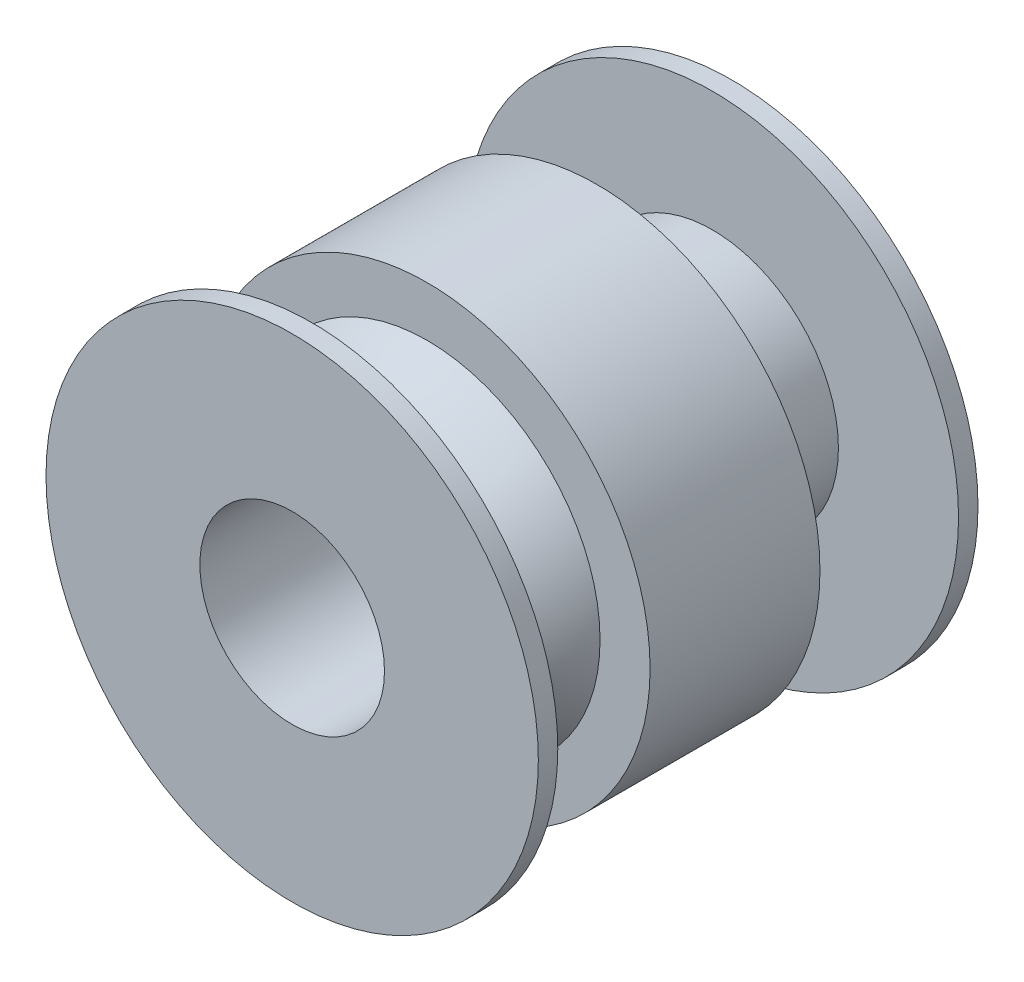
ISO-10303-21;
HEADER;
FILE_DESCRIPTION(('STEP AP214'),'2;1');
FILE_NAME('part.step','',(''),(''),'','','');
FILE_SCHEMA(('AUTOMOTIVE_DESIGN { 1 0 10303 214 1 1 1 1 }'));
ENDSEC;
DATA;
#1=APPLICATION_CONTEXT('core data for automotive mechanical design processes');
#2=APPLICATION_PROTOCOL_DEFINITION('international standard','automotive_design',2000,#1);
#3=PRODUCT_CONTEXT('',#1,'mechanical');
#4=PRODUCT('Part','Part','',(#3));
#5=PRODUCT_RELATED_PRODUCT_CATEGORY('part','',(#4));
#6=PRODUCT_DEFINITION_FORMATION('','',#4);
#7=PRODUCT_DEFINITION_CONTEXT('part definition',#1,'design');
#8=PRODUCT_DEFINITION('design','',#6,#7);
#9=PRODUCT_DEFINITION_SHAPE('','',#8);
#10=(LENGTH_UNIT() NAMED_UNIT(*) SI_UNIT(.MILLI.,.METRE.));
#11=(NAMED_UNIT(*) PLANE_ANGLE_UNIT() SI_UNIT($,.RADIAN.));
#12=(NAMED_UNIT(*) SI_UNIT($,.STERADIAN.) SOLID_ANGLE_UNIT());
#13=UNCERTAINTY_MEASURE_WITH_UNIT(LENGTH_MEASURE(1.E-05),#10,'distance_accuracy_value','');
#14=(GEOMETRIC_REPRESENTATION_CONTEXT(3) GLOBAL_UNCERTAINTY_ASSIGNED_CONTEXT((#13)) GLOBAL_UNIT_ASSIGNED_CONTEXT((#10,
#11,#12)) REPRESENTATION_CONTEXT('',''));
#15=CARTESIAN_POINT('',(0.,0.,0.));
#16=DIRECTION('',(0.,0.,1.));
#17=DIRECTION('',(1.,0.,0.));
#18=AXIS2_PLACEMENT_3D('',#15,#16,#17);
#19=CARTESIAN_POINT('',(0.,-34.749232,-82.4611));
#20=DIRECTION('',(0.,0.,-1.));
#21=DIRECTION('',(-1.,0.,0.));
#22=AXIS2_PLACEMENT_3D('',#19,#20,#21);
#23=PLANE('',#22);
#24=CARTESIAN_POINT('',(0.,-22.049232,-82.4611));
#25=DIRECTION('',(0.,0.,1.));
#26=DIRECTION('',(1.,0.,0.));
#27=AXIS2_PLACEMENT_3D('',#24,#25,#26);
#28=CIRCLE('',#27,4.7625);
#29=CARTESIAN_POINT('',(4.7625,-22.049232,-82.4611));
#30=VERTEX_POINT('',#29);
#31=EDGE_CURVE('E10',#30,#30,#28,.T.);
#32=ORIENTED_EDGE('',*,*,#31,.T.);
#33=EDGE_LOOP('',(#32));
#34=FACE_BOUND('',#33,.T.);
#35=CARTESIAN_POINT('',(0.,-22.049232,-82.4611));
#36=DIRECTION('',(0.,0.,1.));
#37=DIRECTION('',(1.,0.,0.));
#38=AXIS2_PLACEMENT_3D('',#35,#36,#37);
#39=CIRCLE('',#38,12.7);
#40=CARTESIAN_POINT('',(12.7,-22.049232,-82.4611));
#41=VERTEX_POINT('',#40);
#42=EDGE_CURVE('E98',#41,#41,#39,.T.);
#43=ORIENTED_EDGE('',*,*,#42,.F.);
#44=EDGE_LOOP('',(#43));
#45=FACE_BOUND('',#44,.T.);
#46=ADVANCED_FACE('F39',(#34,#45),#23,.T.);
#47=CARTESIAN_POINT('',(0.,-22.049232,-82.1361730867633));
#48=DIRECTION('',(0.,0.,1.));
#49=DIRECTION('',(1.,0.,0.));
#50=AXIS2_PLACEMENT_3D('',#47,#48,#49);
#51=CYLINDRICAL_SURFACE('',#50,4.7625);
#52=CARTESIAN_POINT('',(0.,-22.049232,-59.7789));
#53=DIRECTION('',(0.,0.,1.));
#54=DIRECTION('',(1.,0.,0.));
#55=AXIS2_PLACEMENT_3D('',#52,#53,#54);
#56=CIRCLE('',#55,4.7625);
#57=CARTESIAN_POINT('',(4.7625,-22.049232,-59.7789));
#58=VERTEX_POINT('',#57);
#59=EDGE_CURVE('E46',#58,#58,#56,.T.);
#60=ORIENTED_EDGE('',*,*,#59,.T.);
#61=EDGE_LOOP('',(#60));
#62=FACE_BOUND('',#61,.T.);
#63=ORIENTED_EDGE('',*,*,#31,.F.);
#64=EDGE_LOOP('',(#63));
#65=FACE_BOUND('',#64,.T.);
#66=ADVANCED_FACE('F107',(#62,#65),#51,.F.);
#67=CARTESIAN_POINT('',(0.,-34.749232,-59.7789));
#68=DIRECTION('',(0.,0.,1.));
#69=DIRECTION('',(1.,0.,0.));
#70=AXIS2_PLACEMENT_3D('',#67,#68,#69);
#71=PLANE('',#70);
#72=CARTESIAN_POINT('',(0.,-22.049232,-59.7789));
#73=DIRECTION('',(0.,0.,1.));
#74=DIRECTION('',(1.,0.,0.));
#75=AXIS2_PLACEMENT_3D('',#72,#73,#74);
#76=CIRCLE('',#75,12.7);
#77=CARTESIAN_POINT('',(12.7,-22.049232,-59.7789));
#78=VERTEX_POINT('',#77);
#79=EDGE_CURVE('E51',#78,#78,#76,.T.);
#80=ORIENTED_EDGE('',*,*,#79,.T.);
#81=EDGE_LOOP('',(#80));
#82=FACE_BOUND('',#81,.T.);
#83=ORIENTED_EDGE('',*,*,#59,.F.);
#84=EDGE_LOOP('',(#83));
#85=FACE_BOUND('',#84,.T.);
#86=ADVANCED_FACE('F111',(#82,#85),#71,.T.);
#87=CARTESIAN_POINT('',(0.,-22.049232,-82.1361730867633));
#88=DIRECTION('',(0.,0.,1.));
#89=DIRECTION('',(1.,0.,0.));
#90=AXIS2_PLACEMENT_3D('',#87,#88,#89);
#91=CYLINDRICAL_SURFACE('',#90,12.7);
#92=CARTESIAN_POINT('',(0.,-22.049232,-60.7822));
#93=DIRECTION('',(0.,0.,1.));
#94=DIRECTION('',(1.,0.,0.));
#95=AXIS2_PLACEMENT_3D('',#92,#93,#94);
#96=CIRCLE('',#95,12.7);
#97=CARTESIAN_POINT('',(12.7,-22.049232,-60.7822));
#98=VERTEX_POINT('',#97);
#99=EDGE_CURVE('E56',#98,#98,#96,.T.);
#100=ORIENTED_EDGE('',*,*,#99,.T.);
#101=EDGE_LOOP('',(#100));
#102=FACE_BOUND('',#101,.T.);
#103=ORIENTED_EDGE('',*,*,#79,.F.);
#104=EDGE_LOOP('',(#103));
#105=FACE_BOUND('',#104,.T.);
#106=ADVANCED_FACE('F115',(#102,#105),#91,.T.);
#107=CARTESIAN_POINT('',(0.,-28.551632,-60.7822));
#108=DIRECTION('',(0.,0.,-1.));
#109=DIRECTION('',(-1.,0.,0.));
#110=AXIS2_PLACEMENT_3D('',#107,#108,#109);
#111=PLANE('',#110);
#112=CARTESIAN_POINT('',(0.,-22.049232,-60.7822));
#113=DIRECTION('',(0.,0.,1.));
#114=DIRECTION('',(1.,0.,0.));
#115=AXIS2_PLACEMENT_3D('',#112,#113,#114);
#116=CIRCLE('',#115,6.5024);
#117=CARTESIAN_POINT('',(6.5024,-22.049232,-60.7822));
#118=VERTEX_POINT('',#117);
#119=EDGE_CURVE('E62',#118,#118,#116,.T.);
#120=ORIENTED_EDGE('',*,*,#119,.T.);
#121=EDGE_LOOP('',(#120));
#122=FACE_BOUND('',#121,.T.);
#123=ORIENTED_EDGE('',*,*,#99,.F.);
#124=EDGE_LOOP('',(#123));
#125=FACE_BOUND('',#124,.T.);
#126=ADVANCED_FACE('F122',(#122,#125),#111,.T.);
#127=CARTESIAN_POINT('',(0.,-22.049232,-82.1361730867633));
#128=DIRECTION('',(0.,0.,1.));
#129=DIRECTION('',(1.,0.,0.));
#130=AXIS2_PLACEMENT_3D('',#127,#128,#129);
#131=CYLINDRICAL_SURFACE('',#130,6.5024);
#132=CARTESIAN_POINT('',(0.,-22.049232,-63.6000069614774));
#133=DIRECTION('',(0.,0.,1.));
#134=DIRECTION('',(1.,0.,0.));
#135=AXIS2_PLACEMENT_3D('',#132,#133,#134);
#136=CIRCLE('',#135,6.5024);
#137=CARTESIAN_POINT('',(0.,-28.551632,-63.6000069614774));
#138=VERTEX_POINT('',#137);
#139=EDGE_CURVE('E66',#138,#138,#136,.T.);
#140=ORIENTED_EDGE('',*,*,#139,.T.);
#141=EDGE_LOOP('',(#140));
#142=FACE_BOUND('',#141,.T.);
#143=ORIENTED_EDGE('',*,*,#119,.F.);
#144=EDGE_LOOP('',(#143));
#145=FACE_BOUND('',#144,.T.);
#146=ADVANCED_FACE('F126',(#142,#145),#131,.T.);
#147=CARTESIAN_POINT('',(0.,-22.049232,-71.12));
#148=DIRECTION('',(0.,0.,1.));
#149=DIRECTION('',(0.,-1.,0.));
#150=AXIS2_PLACEMENT_3D('',#147,#148,#149);
#151=SPHERICAL_SURFACE('',#150,9.94140337474685);
#152=CARTESIAN_POINT('',(0.,-22.049232,-66.7385));
#153=DIRECTION('',(0.,0.,1.));
#154=DIRECTION('',(1.,0.,0.));
#155=AXIS2_PLACEMENT_3D('',#152,#153,#154);
#156=CIRCLE('',#155,8.92378612526253);
#157=CARTESIAN_POINT('',(0.,-30.9730181252625,-66.7385));
#158=VERTEX_POINT('',#157);
#159=EDGE_CURVE('E70',#158,#158,#156,.T.);
#160=CARTESIAN_POINT('',(0.,-30.9730181252625,-66.7385));
#161=CARTESIAN_POINT('',(0.,-30.9546968172942,-66.7011850210384));
#162=CARTESIAN_POINT('',(0.,-30.9361414336475,-66.6639849715197));
#163=CARTESIAN_POINT('',(0.,-30.8985654926746,-66.5898205560576));
#164=CARTESIAN_POINT('',(0.,-30.8795449353484,-66.5528561901143));
#165=CARTESIAN_POINT('',(0.,-30.8410416246939,-66.4791689664927));
#166=CARTESIAN_POINT('',(0.,-30.8215588713656,-66.4424461088144));
#167=CARTESIAN_POINT('',(0.,-30.7821342387314,-66.3692476784703));
#168=CARTESIAN_POINT('',(0.,-30.7621923594254,-66.3327721058044));
#169=CARTESIAN_POINT('',(0.,-30.7218526118547,-66.2600739859813));
#170=CARTESIAN_POINT('',(0.,-30.7014547435899,-66.2238514388242));
#171=CARTESIAN_POINT('',(0.,-30.6602062282843,-66.1516650699845));
#172=CARTESIAN_POINT('',(0.,-30.6393555812437,-66.115701248302));
#173=CARTESIAN_POINT('',(0.,-30.5972047894432,-66.0440379898545));
#174=CARTESIAN_POINT('',(0.,-30.5759046446834,-66.0083385530896));
#175=CARTESIAN_POINT('',(0.,-30.5328582093371,-65.9372096822646));
#176=CARTESIAN_POINT('',(0.,-30.5111119187507,-65.9017802482044));
#177=CARTESIAN_POINT('',(0.,-30.4671766138237,-65.8311969581013));
#178=CARTESIAN_POINT('',(0.,-30.4449875994832,-65.7960431020582));
#179=CARTESIAN_POINT('',(0.,-30.4001703387966,-65.7260164999317));
#180=CARTESIAN_POINT('',(0.,-30.3775420924505,-65.6911437538483));
#181=CARTESIAN_POINT('',(0.,-30.3318499286185,-65.6216848593482));
#182=CARTESIAN_POINT('',(0.,-30.3087860111326,-65.5870987109315));
#183=CARTESIAN_POINT('',(0.,-30.2622261344462,-65.5182184543714));
#184=CARTESIAN_POINT('',(0.,-30.2387301752457,-65.4839243462281));
#185=CARTESIAN_POINT('',(0.,-30.1913099125428,-65.4156335668651));
#186=CARTESIAN_POINT('',(0.,-30.1673856090403,-65.3816368956454));
#187=CARTESIAN_POINT('',(0.,-30.1191124225522,-65.3139463399739));
#188=CARTESIAN_POINT('',(0.,-30.0947635395665,-65.2802524555222));
#189=CARTESIAN_POINT('',(0.,-30.0456450257438,-65.2131727755835));
#190=CARTESIAN_POINT('',(0.,-30.0208753949069,-65.1797869800965));
#191=CARTESIAN_POINT('',(0.,-29.9709192832243,-65.1133287318019));
#192=CARTESIAN_POINT('',(0.,-29.9457328023786,-65.0802562789943));
#193=CARTESIAN_POINT('',(0.,-29.8949469541182,-65.0144299204645));
#194=CARTESIAN_POINT('',(0.,-29.8693475867035,-64.9816760147422));
#195=CARTESIAN_POINT('',(0.,-29.8177399937179,-64.9164919046612));
#196=CARTESIAN_POINT('',(0.,-29.7917317681471,-64.8840617003024));
#197=CARTESIAN_POINT('',(0.,-29.7393105516018,-64.8195300962874));
#198=CARTESIAN_POINT('',(0.,-29.7128975606273,-64.7874286966313));
#199=CARTESIAN_POINT('',(0.,-29.6596709697226,-64.7235597536191));
#200=CARTESIAN_POINT('',(0.,-29.6328573697924,-64.6917922102631));
#201=CARTESIAN_POINT('',(0.,-29.5788337804654,-64.6285959789114));
#202=CARTESIAN_POINT('',(0.,-29.5516237910686,-64.5971672909158));
#203=CARTESIAN_POINT('',(0.,-29.4968117046751,-64.5346537160218));
#204=CARTESIAN_POINT('',(0.,-29.4692096076784,-64.5035688291235));
#205=CARTESIAN_POINT('',(0.,-29.4136176496549,-64.4417477480594));
#206=CARTESIAN_POINT('',(0.,-29.3856277886281,-64.4110115538935));
#207=CARTESIAN_POINT('',(0.,-29.3292647071351,-64.3498926950573));
#208=CARTESIAN_POINT('',(0.,-29.3008914866688,-64.319510030387));
#209=CARTESIAN_POINT('',(0.,-29.2437661512124,-64.2591030116738));
#210=CARTESIAN_POINT('',(0.,-29.2150140362224,-64.229078657631));
#211=CARTESIAN_POINT('',(0.,-29.157135436264,-64.1693929849136));
#212=CARTESIAN_POINT('',(0.,-29.1280089512957,-64.139731666239));
#213=CARTESIAN_POINT('',(0.,-29.0693861948185,-64.0807767318931));
#214=CARTESIAN_POINT('',(0.,-29.0398899233096,-64.0514831162218));
#215=CARTESIAN_POINT('',(0.,-28.980532235455,-63.9932681975692));
#216=CARTESIAN_POINT('',(0.,-28.9506708191094,-63.964346894588));
#217=CARTESIAN_POINT('',(0.,-28.890587540465,-63.9068811527306));
#218=CARTESIAN_POINT('',(0.,-28.8603656781663,-63.8783367138544));
#219=CARTESIAN_POINT('',(0.,-28.7995662642682,-63.8216291911362));
#220=CARTESIAN_POINT('',(0.,-28.7689887126688,-63.7934661072941));
#221=CARTESIAN_POINT('',(0.,-28.7074827288851,-63.7375257299696));
#222=CARTESIAN_POINT('',(0.,-28.6765542967007,-63.7097484364872));
#223=CARTESIAN_POINT('',(0.,-28.6143514302681,-63.6545839980472));
#224=CARTESIAN_POINT('',(0.,-28.5830769960198,-63.6271968530898));
#225=CARTESIAN_POINT('',(0.,-28.551632,-63.6000069614774));
#226=B_SPLINE_CURVE_WITH_KNOTS('',3,(#160,#161,#162,#163,#164,#165,#166,#167,#168,#169,#170,
#171,#172,#173,#174,#175,#176,#177,#178,#179,#180,#181,#182,#183,#184,#185,#186,#187,#188,#189,
#190,#191,#192,#193,#194,#195,#196,#197,#198,#199,#200,#201,#202,#203,#204,#205,#206,#207,#208,
#209,#210,#211,#212,#213,#214,#215,#216,#217,#218,#219,#220,#221,#222,#223,#224,#225),
.UNSPECIFIED.,.F.,.F.,(4,2,2,2,2,2,2,2,2,2,2,2,2,2,2,2,2,2,2,2,2,2,2,2,2,2,2,2,2,2,2,2,4),(0.,
0.124709653743761,0.249419307487528,0.374128961231285,0.49883861497504,0.62354826871879,
0.748257922462551,0.872967576206311,0.997677229950065,1.12238688369382,1.24709653743757,
1.37180619118134,1.49651584492509,1.62122549866885,1.74593515241261,1.87064480615637,
1.99535445990012,2.12006411364388,2.24477376738763,2.3694834211314,2.49419307487515,
2.61890272861891,2.74361238236267,2.86832203610643,2.99303168985017,3.11774134359393,
3.24245099733769,3.36716065108145,3.4918703048252,3.61657995856896,3.74128961231272,
3.86599926605648,3.99070891980024),.UNSPECIFIED.);
#227=EDGE_CURVE('BSEAM130',#158,#138,#226,.T.);
#228=ORIENTED_EDGE('',*,*,#159,.T.);
#229=ORIENTED_EDGE('',*,*,#139,.F.);
#230=ORIENTED_EDGE('',*,*,#227,.T.);
#231=ORIENTED_EDGE('',*,*,#227,.F.);
#232=EDGE_LOOP('',(#228,#230,#229,#231));
#233=FACE_BOUND('',#232,.T.);
#234=ADVANCED_FACE('F130',(#233),#151,.T.);
#235=CARTESIAN_POINT('',(0.,-30.9730181252625,-66.7385));
#236=DIRECTION('',(0.,0.,1.));
#237=DIRECTION('',(1.,0.,0.));
#238=AXIS2_PLACEMENT_3D('',#235,#236,#237);
#239=PLANE('',#238);
#240=CARTESIAN_POINT('',(0.,-22.049232,-66.7385));
#241=DIRECTION('',(0.,0.,1.));
#242=DIRECTION('',(1.,0.,0.));
#243=AXIS2_PLACEMENT_3D('',#240,#241,#242);
#244=CIRCLE('',#243,11.5062);
#245=CARTESIAN_POINT('',(11.5062,-22.049232,-66.7385));
#246=VERTEX_POINT('',#245);
#247=EDGE_CURVE('E74',#246,#246,#244,.T.);
#248=ORIENTED_EDGE('',*,*,#247,.T.);
#249=EDGE_LOOP('',(#248));
#250=FACE_BOUND('',#249,.T.);
#251=ORIENTED_EDGE('',*,*,#159,.F.);
#252=EDGE_LOOP('',(#251));
#253=FACE_BOUND('',#252,.T.);
#254=ADVANCED_FACE('F134',(#250,#253),#239,.T.);
#255=CARTESIAN_POINT('',(0.,-22.049232,-82.1361730867633));
#256=DIRECTION('',(0.,0.,1.));
#257=DIRECTION('',(1.,0.,0.));
#258=AXIS2_PLACEMENT_3D('',#255,#256,#257);
#259=CYLINDRICAL_SURFACE('',#258,11.5062);
#260=CARTESIAN_POINT('',(0.,-22.049232,-75.5015));
#261=DIRECTION('',(0.,0.,1.));
#262=DIRECTION('',(1.,0.,0.));
#263=AXIS2_PLACEMENT_3D('',#260,#261,#262);
#264=CIRCLE('',#263,11.5062);
#265=CARTESIAN_POINT('',(11.5062,-22.049232,-75.5015));
#266=VERTEX_POINT('',#265);
#267=EDGE_CURVE('E78',#266,#266,#264,.T.);
#268=ORIENTED_EDGE('',*,*,#267,.T.);
#269=EDGE_LOOP('',(#268));
#270=FACE_BOUND('',#269,.T.);
#271=ORIENTED_EDGE('',*,*,#247,.F.);
#272=EDGE_LOOP('',(#271));
#273=FACE_BOUND('',#272,.T.);
#274=ADVANCED_FACE('F138',(#270,#273),#259,.T.);
#275=CARTESIAN_POINT('',(0.,-33.555432,-75.5015));
#276=DIRECTION('',(0.,0.,-1.));
#277=DIRECTION('',(-1.,0.,0.));
#278=AXIS2_PLACEMENT_3D('',#275,#276,#277);
#279=PLANE('',#278);
#280=CARTESIAN_POINT('',(0.,-22.049232,-75.5015));
#281=DIRECTION('',(0.,0.,1.));
#282=DIRECTION('',(1.,0.,0.));
#283=AXIS2_PLACEMENT_3D('',#280,#281,#282);
#284=CIRCLE('',#283,8.92378612526253);
#285=CARTESIAN_POINT('',(0.,-30.9730181252625,-75.5015));
#286=VERTEX_POINT('',#285);
#287=EDGE_CURVE('E82',#286,#286,#284,.T.);
#288=ORIENTED_EDGE('',*,*,#287,.T.);
#289=EDGE_LOOP('',(#288));
#290=FACE_BOUND('',#289,.T.);
#291=ORIENTED_EDGE('',*,*,#267,.F.);
#292=EDGE_LOOP('',(#291));
#293=FACE_BOUND('',#292,.T.);
#294=ADVANCED_FACE('F142',(#290,#293),#279,.T.);
#295=CARTESIAN_POINT('',(0.,-22.049232,-71.12));
#296=DIRECTION('',(0.,0.,1.));
#297=DIRECTION('',(0.,-1.,0.));
#298=AXIS2_PLACEMENT_3D('',#295,#296,#297);
#299=SPHERICAL_SURFACE('',#298,9.94140337474685);
#300=CARTESIAN_POINT('',(0.,-22.049232,-78.6399930385226));
#301=DIRECTION('',(0.,0.,1.));
#302=DIRECTION('',(1.,0.,0.));
#303=AXIS2_PLACEMENT_3D('',#300,#301,#302);
#304=CIRCLE('',#303,6.5024);
#305=CARTESIAN_POINT('',(0.,-28.551632,-78.6399930385226));
#306=VERTEX_POINT('',#305);
#307=EDGE_CURVE('E86',#306,#306,#304,.T.);
#308=CARTESIAN_POINT('',(0.,-28.551632,-78.6399930385226));
#309=CARTESIAN_POINT('',(0.,-28.5830769960198,-78.6128031469102));
#310=CARTESIAN_POINT('',(0.,-28.6143514302681,-78.5854160019528));
#311=CARTESIAN_POINT('',(0.,-28.6765542967007,-78.5302515635128));
#312=CARTESIAN_POINT('',(0.,-28.707482728885,-78.5024742700304));
#313=CARTESIAN_POINT('',(0.,-28.7689887126688,-78.4465338927059));
#314=CARTESIAN_POINT('',(0.,-28.7995662642682,-78.4183708088638));
#315=CARTESIAN_POINT('',(0.,-28.8603656781663,-78.3616632861455));
#316=CARTESIAN_POINT('',(0.,-28.890587540465,-78.3331188472694));
#317=CARTESIAN_POINT('',(0.,-28.9506708191094,-78.275653105412));
#318=CARTESIAN_POINT('',(0.,-28.980532235455,-78.2467318024308));
#319=CARTESIAN_POINT('',(0.,-29.0398899233096,-78.1885168837782));
#320=CARTESIAN_POINT('',(0.,-29.0693861948185,-78.1592232681069));
#321=CARTESIAN_POINT('',(0.,-29.1280089512957,-78.100268333761));
#322=CARTESIAN_POINT('',(0.,-29.157135436264,-78.0706070150864));
#323=CARTESIAN_POINT('',(0.,-29.2150140362223,-78.010921342369));
#324=CARTESIAN_POINT('',(0.,-29.2437661512124,-77.9808969883262));
#325=CARTESIAN_POINT('',(0.,-29.3008914866688,-77.920489969613));
#326=CARTESIAN_POINT('',(0.,-29.3292647071351,-77.8901073049427));
#327=CARTESIAN_POINT('',(0.,-29.3856277886281,-77.8289884461065));
#328=CARTESIAN_POINT('',(0.,-29.4136176496549,-77.7982522519406));
#329=CARTESIAN_POINT('',(0.,-29.4692096076783,-77.7364311708765));
#330=CARTESIAN_POINT('',(0.,-29.4968117046751,-77.7053462839782));
#331=CARTESIAN_POINT('',(0.,-29.5516237910686,-77.6428327090842));
#332=CARTESIAN_POINT('',(0.,-29.5788337804654,-77.6114040210886));
#333=CARTESIAN_POINT('',(0.,-29.6328573697924,-77.5482077897369));
#334=CARTESIAN_POINT('',(0.,-29.6596709697226,-77.5164402463809));
#335=CARTESIAN_POINT('',(0.,-29.7128975606273,-77.4525713033687));
#336=CARTESIAN_POINT('',(0.,-29.7393105516017,-77.4204699037126));
#337=CARTESIAN_POINT('',(0.,-29.791731768147,-77.3559382996976));
#338=CARTESIAN_POINT('',(0.,-29.8177399937179,-77.3235080953388));
#339=CARTESIAN_POINT('',(0.,-29.8693475867035,-77.2583239852578));
#340=CARTESIAN_POINT('',(0.,-29.8949469541182,-77.2255700795355));
#341=CARTESIAN_POINT('',(0.,-29.9457328023786,-77.1597437210056));
#342=CARTESIAN_POINT('',(0.,-29.9709192832243,-77.1266712681981));
#343=CARTESIAN_POINT('',(0.,-30.0208753949069,-77.0602130199035));
#344=CARTESIAN_POINT('',(0.,-30.0456450257438,-77.0268272244165));
#345=CARTESIAN_POINT('',(0.,-30.0947635395665,-76.9597475444778));
#346=CARTESIAN_POINT('',(0.,-30.1191124225522,-76.9260536600261));
#347=CARTESIAN_POINT('',(0.,-30.1673856090403,-76.8583631043546));
#348=CARTESIAN_POINT('',(0.,-30.1913099125428,-76.8243664331349));
#349=CARTESIAN_POINT('',(0.,-30.2387301752457,-76.7560756537719));
#350=CARTESIAN_POINT('',(0.,-30.2622261344462,-76.7217815456286));
#351=CARTESIAN_POINT('',(0.,-30.3087860111326,-76.6529012890685));
#352=CARTESIAN_POINT('',(0.,-30.3318499286185,-76.6183151406518));
#353=CARTESIAN_POINT('',(0.,-30.3775420924505,-76.5488562461517));
#354=CARTESIAN_POINT('',(0.,-30.4001703387966,-76.5139835000683));
#355=CARTESIAN_POINT('',(0.,-30.4449875994832,-76.4439568979418));
#356=CARTESIAN_POINT('',(0.,-30.4671766138237,-76.4088030418987));
#357=CARTESIAN_POINT('',(0.,-30.5111119187507,-76.3382197517955));
#358=CARTESIAN_POINT('',(0.,-30.5328582093371,-76.3027903177354));
#359=CARTESIAN_POINT('',(0.,-30.5759046446834,-76.2316614469104));
#360=CARTESIAN_POINT('',(0.,-30.5972047894432,-76.1959620101455));
#361=CARTESIAN_POINT('',(0.,-30.6393555812437,-76.124298751698));
#362=CARTESIAN_POINT('',(0.,-30.6602062282843,-76.0883349300155));
#363=CARTESIAN_POINT('',(0.,-30.7014547435898,-76.0161485611758));
#364=CARTESIAN_POINT('',(0.,-30.7218526118547,-75.9799260140186));
#365=CARTESIAN_POINT('',(0.,-30.7621923594254,-75.9072278941956));
#366=CARTESIAN_POINT('',(0.,-30.7821342387314,-75.8707523215297));
#367=CARTESIAN_POINT('',(0.,-30.8215588713656,-75.7975538911856));
#368=CARTESIAN_POINT('',(0.,-30.8410416246939,-75.7608310335073));
#369=CARTESIAN_POINT('',(0.,-30.8795449353484,-75.6871438098857));
#370=CARTESIAN_POINT('',(0.,-30.8985654926746,-75.6501794439424));
#371=CARTESIAN_POINT('',(0.,-30.9361414336475,-75.5760150284803));
#372=CARTESIAN_POINT('',(0.,-30.9546968172942,-75.5388149789616));
#373=CARTESIAN_POINT('',(0.,-30.9730181252625,-75.5015));
#374=B_SPLINE_CURVE_WITH_KNOTS('',3,(#308,#309,#310,#311,#312,#313,#314,#315,#316,#317,#318,
#319,#320,#321,#322,#323,#324,#325,#326,#327,#328,#329,#330,#331,#332,#333,#334,#335,#336,#337,
#338,#339,#340,#341,#342,#343,#344,#345,#346,#347,#348,#349,#350,#351,#352,#353,#354,#355,#356,
#357,#358,#359,#360,#361,#362,#363,#364,#365,#366,#367,#368,#369,#370,#371,#372,#373),
.UNSPECIFIED.,.F.,.F.,(4,2,2,2,2,2,2,2,2,2,2,2,2,2,2,2,2,2,2,2,2,2,2,2,2,2,2,2,2,2,2,2,4),(0.,
0.124709653743763,0.249419307487516,0.374128961231278,0.498838614975035,0.623548268718788,
0.748257922462548,0.872967576206305,0.997677229950066,1.12238688369382,1.24709653743757,
1.37180619118134,1.49651584492509,1.62122549866884,1.74593515241261,1.87064480615636,
1.99535445990012,2.12006411364387,2.24477376738764,2.3694834211314,2.49419307487515,
2.61890272861891,2.74361238236267,2.86832203610642,2.99303168985018,3.11774134359393,
3.24245099733769,3.36716065108146,3.49187030482521,3.61657995856897,3.74128961231272,
3.86599926605648,3.99070891980023),.UNSPECIFIED.);
#375=EDGE_CURVE('BSEAM146',#306,#286,#374,.T.);
#376=ORIENTED_EDGE('',*,*,#307,.T.);
#377=ORIENTED_EDGE('',*,*,#287,.F.);
#378=ORIENTED_EDGE('',*,*,#375,.T.);
#379=ORIENTED_EDGE('',*,*,#375,.F.);
#380=EDGE_LOOP('',(#376,#378,#377,#379));
#381=FACE_BOUND('',#380,.T.);
#382=ADVANCED_FACE('F146',(#381),#299,.T.);
#383=CARTESIAN_POINT('',(0.,-22.049232,-82.1361730867633));
#384=DIRECTION('',(0.,0.,1.));
#385=DIRECTION('',(1.,0.,0.));
#386=AXIS2_PLACEMENT_3D('',#383,#384,#385);
#387=CYLINDRICAL_SURFACE('',#386,6.5024);
#388=CARTESIAN_POINT('',(0.,-22.049232,-81.4578));
#389=DIRECTION('',(0.,0.,1.));
#390=DIRECTION('',(1.,0.,0.));
#391=AXIS2_PLACEMENT_3D('',#388,#389,#390);
#392=CIRCLE('',#391,6.5024);
#393=CARTESIAN_POINT('',(6.5024,-22.049232,-81.4578));
#394=VERTEX_POINT('',#393);
#395=EDGE_CURVE('E90',#394,#394,#392,.T.);
#396=ORIENTED_EDGE('',*,*,#395,.T.);
#397=EDGE_LOOP('',(#396));
#398=FACE_BOUND('',#397,.T.);
#399=ORIENTED_EDGE('',*,*,#307,.F.);
#400=EDGE_LOOP('',(#399));
#401=FACE_BOUND('',#400,.T.);
#402=ADVANCED_FACE('F150',(#398,#401),#387,.T.);
#403=CARTESIAN_POINT('',(0.,-28.551632,-81.4578));
#404=DIRECTION('',(0.,0.,1.));
#405=DIRECTION('',(1.,0.,0.));
#406=AXIS2_PLACEMENT_3D('',#403,#404,#405);
#407=PLANE('',#406);
#408=CARTESIAN_POINT('',(0.,-22.049232,-81.4578));
#409=DIRECTION('',(0.,0.,1.));
#410=DIRECTION('',(1.,0.,0.));
#411=AXIS2_PLACEMENT_3D('',#408,#409,#410);
#412=CIRCLE('',#411,12.7);
#413=CARTESIAN_POINT('',(12.7,-22.049232,-81.4578));
#414=VERTEX_POINT('',#413);
#415=EDGE_CURVE('E94',#414,#414,#412,.T.);
#416=ORIENTED_EDGE('',*,*,#415,.T.);
#417=EDGE_LOOP('',(#416));
#418=FACE_BOUND('',#417,.T.);
#419=ORIENTED_EDGE('',*,*,#395,.F.);
#420=EDGE_LOOP('',(#419));
#421=FACE_BOUND('',#420,.T.);
#422=ADVANCED_FACE('F154',(#418,#421),#407,.T.);
#423=CARTESIAN_POINT('',(0.,-22.049232,-82.1361730867633));
#424=DIRECTION('',(0.,0.,1.));
#425=DIRECTION('',(1.,0.,0.));
#426=AXIS2_PLACEMENT_3D('',#423,#424,#425);
#427=CYLINDRICAL_SURFACE('',#426,12.7);
#428=ORIENTED_EDGE('',*,*,#42,.T.);
#429=EDGE_LOOP('',(#428));
#430=FACE_BOUND('',#429,.T.);
#431=ORIENTED_EDGE('',*,*,#415,.F.);
#432=EDGE_LOOP('',(#431));
#433=FACE_BOUND('',#432,.T.);
#434=ADVANCED_FACE('F103',(#430,#433),#427,.T.);
#435=CLOSED_SHELL('',(#46,#66,#86,#106,#126,#146,#234,#254,#274,#294,#382,#402,#422,#434));
#436=MANIFOLD_SOLID_BREP('B2',#435);
#437=ADVANCED_BREP_SHAPE_REPRESENTATION('',(#18,#436),#14);
#438=SHAPE_DEFINITION_REPRESENTATION(#9,#437);
ENDSEC;
END-ISO-10303-21;
